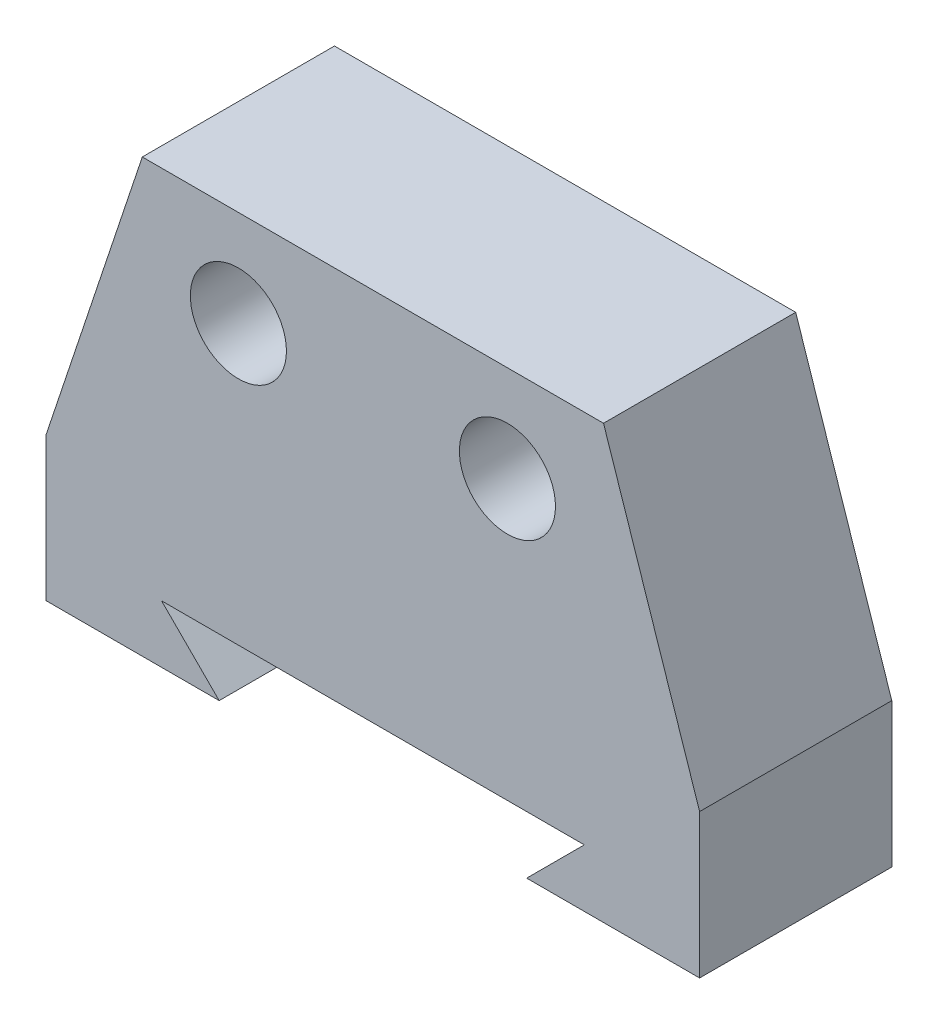
ISO-10303-21;
HEADER;
FILE_DESCRIPTION(('STEP AP214'),'2;1');
FILE_NAME('part.step','',(''),(''),'','','');
FILE_SCHEMA(('AUTOMOTIVE_DESIGN { 1 0 10303 214 1 1 1 1 }'));
ENDSEC;
DATA;
#1=APPLICATION_CONTEXT('core data for automotive mechanical design processes');
#2=APPLICATION_PROTOCOL_DEFINITION('international standard','automotive_design',2000,#1);
#3=PRODUCT_CONTEXT('',#1,'mechanical');
#4=PRODUCT('Part','Part','',(#3));
#5=PRODUCT_RELATED_PRODUCT_CATEGORY('part','',(#4));
#6=PRODUCT_DEFINITION_FORMATION('','',#4);
#7=PRODUCT_DEFINITION_CONTEXT('part definition',#1,'design');
#8=PRODUCT_DEFINITION('design','',#6,#7);
#9=PRODUCT_DEFINITION_SHAPE('','',#8);
#10=(LENGTH_UNIT() NAMED_UNIT(*) SI_UNIT(.MILLI.,.METRE.));
#11=(NAMED_UNIT(*) PLANE_ANGLE_UNIT() SI_UNIT($,.RADIAN.));
#12=(NAMED_UNIT(*) SI_UNIT($,.STERADIAN.) SOLID_ANGLE_UNIT());
#13=UNCERTAINTY_MEASURE_WITH_UNIT(LENGTH_MEASURE(1.E-05),#10,'distance_accuracy_value','');
#14=(GEOMETRIC_REPRESENTATION_CONTEXT(3) GLOBAL_UNCERTAINTY_ASSIGNED_CONTEXT((#13)) GLOBAL_UNIT_ASSIGNED_CONTEXT((#10,
#11,#12)) REPRESENTATION_CONTEXT('',''));
#15=CARTESIAN_POINT('',(0.,0.,0.));
#16=DIRECTION('',(0.,0.,1.));
#17=DIRECTION('',(1.,0.,0.));
#18=AXIS2_PLACEMENT_3D('',#15,#16,#17);
#19=CARTESIAN_POINT('',(0.,39.,10.));
#20=DIRECTION('',(0.,1.,0.));
#21=DIRECTION('',(-1.,0.,0.));
#22=AXIS2_PLACEMENT_3D('',#19,#20,#21);
#23=PLANE('',#22);
#24=DIRECTION('',(1.,0.,0.));
#25=VECTOR('',#24,1.);
#26=CARTESIAN_POINT('',(0.,39.,-10.));
#27=LINE('',#26,#25);
#28=CARTESIAN_POINT('',(-24.,39.,-10.));
#29=VERTEX_POINT('',#28);
#30=CARTESIAN_POINT('',(24.,39.,-10.));
#31=VERTEX_POINT('',#30);
#32=EDGE_CURVE('E146',#29,#31,#27,.T.);
#33=ORIENTED_EDGE('',*,*,#32,.F.);
#34=DIRECTION('',(0.,0.,-1.));
#35=VECTOR('',#34,1.);
#36=CARTESIAN_POINT('',(-24.,39.,10.));
#37=LINE('',#36,#35);
#38=CARTESIAN_POINT('',(-24.,39.,10.));
#39=VERTEX_POINT('',#38);
#40=EDGE_CURVE('E11',#39,#29,#37,.T.);
#41=ORIENTED_EDGE('',*,*,#40,.F.);
#42=DIRECTION('',(1.,0.,0.));
#43=VECTOR('',#42,1.);
#44=CARTESIAN_POINT('',(0.,39.,10.));
#45=LINE('',#44,#43);
#46=CARTESIAN_POINT('',(24.,39.,10.));
#47=VERTEX_POINT('',#46);
#48=EDGE_CURVE('E175',#39,#47,#45,.T.);
#49=ORIENTED_EDGE('',*,*,#48,.T.);
#50=DIRECTION('',(0.,0.,-1.));
#51=VECTOR('',#50,1.);
#52=CARTESIAN_POINT('',(24.,39.,10.));
#53=LINE('',#52,#51);
#54=EDGE_CURVE('E49',#47,#31,#53,.T.);
#55=ORIENTED_EDGE('',*,*,#54,.T.);
#56=EDGE_LOOP('',(#33,#41,#49,#55));
#57=FACE_BOUND('',#56,.T.);
#58=ADVANCED_FACE('F33',(#57),#23,.T.);
#59=CARTESIAN_POINT('',(-33.3,11.1,10.));
#60=DIRECTION('',(0.948683298050514,-0.316227766016838,0.));
#61=DIRECTION('',(0.316227766016838,0.948683298050514,0.));
#62=AXIS2_PLACEMENT_3D('',#59,#60,#61);
#63=PLANE('',#62);
#64=DIRECTION('',(-0.316227766016838,-0.948683298050514,0.));
#65=VECTOR('',#64,1.);
#66=CARTESIAN_POINT('',(-33.3,11.1,-10.));
#67=LINE('',#66,#65);
#68=CARTESIAN_POINT('',(-34.,9.,-10.));
#69=VERTEX_POINT('',#68);
#70=EDGE_CURVE('E148',#29,#69,#67,.T.);
#71=ORIENTED_EDGE('',*,*,#70,.T.);
#72=DIRECTION('',(0.,0.,-1.));
#73=VECTOR('',#72,1.);
#74=CARTESIAN_POINT('',(-34.,9.,10.));
#75=LINE('',#74,#73);
#76=CARTESIAN_POINT('',(-34.,9.,10.));
#77=VERTEX_POINT('',#76);
#78=EDGE_CURVE('E41',#77,#69,#75,.T.);
#79=ORIENTED_EDGE('',*,*,#78,.F.);
#80=DIRECTION('',(-0.316227766016838,-0.948683298050514,0.));
#81=VECTOR('',#80,1.);
#82=CARTESIAN_POINT('',(-33.3,11.1,10.));
#83=LINE('',#82,#81);
#84=EDGE_CURVE('E214',#39,#77,#83,.T.);
#85=ORIENTED_EDGE('',*,*,#84,.F.);
#86=ORIENTED_EDGE('',*,*,#40,.T.);
#87=EDGE_LOOP('',(#71,#79,#85,#86));
#88=FACE_BOUND('',#87,.T.);
#89=ADVANCED_FACE('F240',(#88),#63,.F.);
#90=CARTESIAN_POINT('',(-34.,0.,10.));
#91=DIRECTION('',(1.,0.,0.));
#92=DIRECTION('',(0.,1.,0.));
#93=AXIS2_PLACEMENT_3D('',#90,#91,#92);
#94=PLANE('',#93);
#95=DIRECTION('',(0.,-1.,0.));
#96=VECTOR('',#95,1.);
#97=CARTESIAN_POINT('',(-34.,0.,-10.));
#98=LINE('',#97,#96);
#99=CARTESIAN_POINT('',(-34.,-6.,-10.));
#100=VERTEX_POINT('',#99);
#101=EDGE_CURVE('E150',#69,#100,#98,.T.);
#102=ORIENTED_EDGE('',*,*,#101,.T.);
#103=DIRECTION('',(0.,0.,-1.));
#104=VECTOR('',#103,1.);
#105=CARTESIAN_POINT('',(-34.,-6.,10.));
#106=LINE('',#105,#104);
#107=CARTESIAN_POINT('',(-34.,-6.,10.));
#108=VERTEX_POINT('',#107);
#109=EDGE_CURVE('E186',#108,#100,#106,.T.);
#110=ORIENTED_EDGE('',*,*,#109,.F.);
#111=DIRECTION('',(0.,-1.,0.));
#112=VECTOR('',#111,1.);
#113=CARTESIAN_POINT('',(-34.,0.,10.));
#114=LINE('',#113,#112);
#115=EDGE_CURVE('E194',#77,#108,#114,.T.);
#116=ORIENTED_EDGE('',*,*,#115,.F.);
#117=ORIENTED_EDGE('',*,*,#78,.T.);
#118=EDGE_LOOP('',(#102,#110,#116,#117));
#119=FACE_BOUND('',#118,.T.);
#120=ADVANCED_FACE('F192',(#119),#94,.F.);
#121=CARTESIAN_POINT('',(0.,-6.,10.));
#122=DIRECTION('',(0.,-1.,0.));
#123=DIRECTION('',(1.,0.,0.));
#124=AXIS2_PLACEMENT_3D('',#121,#122,#123);
#125=PLANE('',#124);
#126=DIRECTION('',(-1.,0.,0.));
#127=VECTOR('',#126,1.);
#128=CARTESIAN_POINT('',(0.,-6.,-10.));
#129=LINE('',#128,#127);
#130=CARTESIAN_POINT('',(-16.,-6.,-10.));
#131=VERTEX_POINT('',#130);
#132=EDGE_CURVE('E153',#131,#100,#129,.T.);
#133=ORIENTED_EDGE('',*,*,#132,.F.);
#134=DIRECTION('',(0.,0.,-1.));
#135=VECTOR('',#134,1.);
#136=CARTESIAN_POINT('',(-16.,-6.,10.));
#137=LINE('',#136,#135);
#138=CARTESIAN_POINT('',(-16.,-6.,10.));
#139=VERTEX_POINT('',#138);
#140=EDGE_CURVE('E184',#139,#131,#137,.T.);
#141=ORIENTED_EDGE('',*,*,#140,.F.);
#142=DIRECTION('',(-1.,0.,0.));
#143=VECTOR('',#142,1.);
#144=CARTESIAN_POINT('',(0.,-6.,10.));
#145=LINE('',#144,#143);
#146=EDGE_CURVE('E207',#139,#108,#145,.T.);
#147=ORIENTED_EDGE('',*,*,#146,.T.);
#148=ORIENTED_EDGE('',*,*,#109,.T.);
#149=EDGE_LOOP('',(#133,#141,#147,#148));
#150=FACE_BOUND('',#149,.T.);
#151=ADVANCED_FACE('F204',(#150),#125,.T.);
#152=CARTESIAN_POINT('',(-11.,-11.,10.));
#153=DIRECTION('',(0.707106781186549,0.707106781186546,0.));
#154=DIRECTION('',(-0.707106781186546,0.707106781186549,0.));
#155=AXIS2_PLACEMENT_3D('',#152,#153,#154);
#156=PLANE('',#155);
#157=DIRECTION('',(0.707106781186546,-0.707106781186549,0.));
#158=VECTOR('',#157,1.);
#159=CARTESIAN_POINT('',(-11.,-11.,-10.));
#160=LINE('',#159,#158);
#161=CARTESIAN_POINT('',(-22.,0.,-10.));
#162=VERTEX_POINT('',#161);
#163=EDGE_CURVE('E156',#162,#131,#160,.T.);
#164=ORIENTED_EDGE('',*,*,#163,.F.);
#165=DIRECTION('',(0.,0.,-1.));
#166=VECTOR('',#165,1.);
#167=CARTESIAN_POINT('',(-22.,0.,10.));
#168=LINE('',#167,#166);
#169=CARTESIAN_POINT('',(-22.,0.,10.));
#170=VERTEX_POINT('',#169);
#171=EDGE_CURVE('E182',#170,#162,#168,.T.);
#172=ORIENTED_EDGE('',*,*,#171,.F.);
#173=DIRECTION('',(0.707106781186546,-0.707106781186549,0.));
#174=VECTOR('',#173,1.);
#175=CARTESIAN_POINT('',(-11.,-11.,10.));
#176=LINE('',#175,#174);
#177=EDGE_CURVE('E210',#170,#139,#176,.T.);
#178=ORIENTED_EDGE('',*,*,#177,.T.);
#179=ORIENTED_EDGE('',*,*,#140,.T.);
#180=EDGE_LOOP('',(#164,#172,#178,#179));
#181=FACE_BOUND('',#180,.T.);
#182=ADVANCED_FACE('F251',(#181),#156,.T.);
#183=CARTESIAN_POINT('',(0.,0.,10.));
#184=DIRECTION('',(0.,1.,0.));
#185=DIRECTION('',(-1.,0.,0.));
#186=AXIS2_PLACEMENT_3D('',#183,#184,#185);
#187=PLANE('',#186);
#188=DIRECTION('',(1.,0.,0.));
#189=VECTOR('',#188,1.);
#190=CARTESIAN_POINT('',(0.,0.,-10.));
#191=LINE('',#190,#189);
#192=CARTESIAN_POINT('',(22.,0.,-10.));
#193=VERTEX_POINT('',#192);
#194=EDGE_CURVE('E159',#162,#193,#191,.T.);
#195=ORIENTED_EDGE('',*,*,#194,.T.);
#196=DIRECTION('',(0.,0.,-1.));
#197=VECTOR('',#196,1.);
#198=CARTESIAN_POINT('',(22.,0.,10.));
#199=LINE('',#198,#197);
#200=CARTESIAN_POINT('',(22.,0.,10.));
#201=VERTEX_POINT('',#200);
#202=EDGE_CURVE('E179',#201,#193,#199,.T.);
#203=ORIENTED_EDGE('',*,*,#202,.F.);
#204=DIRECTION('',(1.,0.,0.));
#205=VECTOR('',#204,1.);
#206=CARTESIAN_POINT('',(0.,0.,10.));
#207=LINE('',#206,#205);
#208=EDGE_CURVE('E212',#170,#201,#207,.T.);
#209=ORIENTED_EDGE('',*,*,#208,.F.);
#210=ORIENTED_EDGE('',*,*,#171,.T.);
#211=EDGE_LOOP('',(#195,#203,#209,#210));
#212=FACE_BOUND('',#211,.T.);
#213=ADVANCED_FACE('F221',(#212),#187,.F.);
#214=CARTESIAN_POINT('',(11.,-11.,10.));
#215=DIRECTION('',(0.707106781186549,-0.707106781186546,0.));
#216=DIRECTION('',(0.707106781186546,0.707106781186549,0.));
#217=AXIS2_PLACEMENT_3D('',#214,#215,#216);
#218=PLANE('',#217);
#219=DIRECTION('',(-0.707106781186546,-0.707106781186549,0.));
#220=VECTOR('',#219,1.);
#221=CARTESIAN_POINT('',(11.,-11.,-10.));
#222=LINE('',#221,#220);
#223=CARTESIAN_POINT('',(16.,-5.99999999999999,-10.));
#224=VERTEX_POINT('',#223);
#225=EDGE_CURVE('E161',#193,#224,#222,.T.);
#226=ORIENTED_EDGE('',*,*,#225,.T.);
#227=DIRECTION('',(0.,0.,-1.));
#228=VECTOR('',#227,1.);
#229=CARTESIAN_POINT('',(16.,-5.99999999999999,10.));
#230=LINE('',#229,#228);
#231=CARTESIAN_POINT('',(16.,-5.99999999999999,10.));
#232=VERTEX_POINT('',#231);
#233=EDGE_CURVE('E132',#232,#224,#230,.T.);
#234=ORIENTED_EDGE('',*,*,#233,.F.);
#235=DIRECTION('',(-0.707106781186546,-0.707106781186549,0.));
#236=VECTOR('',#235,1.);
#237=CARTESIAN_POINT('',(11.,-11.,10.));
#238=LINE('',#237,#236);
#239=EDGE_CURVE('E120',#201,#232,#238,.T.);
#240=ORIENTED_EDGE('',*,*,#239,.F.);
#241=ORIENTED_EDGE('',*,*,#202,.T.);
#242=EDGE_LOOP('',(#226,#234,#240,#241));
#243=FACE_BOUND('',#242,.T.);
#244=ADVANCED_FACE('F224',(#243),#218,.F.);
#245=CARTESIAN_POINT('',(0.,-6.,10.));
#246=DIRECTION('',(0.,1.,0.));
#247=DIRECTION('',(-1.,0.,0.));
#248=AXIS2_PLACEMENT_3D('',#245,#246,#247);
#249=PLANE('',#248);
#250=DIRECTION('',(1.,0.,0.));
#251=VECTOR('',#250,1.);
#252=CARTESIAN_POINT('',(0.,-6.,-10.));
#253=LINE('',#252,#251);
#254=CARTESIAN_POINT('',(34.,-5.99999999999999,-10.));
#255=VERTEX_POINT('',#254);
#256=EDGE_CURVE('E129',#224,#255,#253,.T.);
#257=ORIENTED_EDGE('',*,*,#256,.T.);
#258=DIRECTION('',(0.,0.,-1.));
#259=VECTOR('',#258,1.);
#260=CARTESIAN_POINT('',(34.,-5.99999999999999,10.));
#261=LINE('',#260,#259);
#262=CARTESIAN_POINT('',(34.,-5.99999999999999,10.));
#263=VERTEX_POINT('',#262);
#264=EDGE_CURVE('E126',#263,#255,#261,.T.);
#265=ORIENTED_EDGE('',*,*,#264,.F.);
#266=DIRECTION('',(1.,0.,0.));
#267=VECTOR('',#266,1.);
#268=CARTESIAN_POINT('',(0.,-6.,10.));
#269=LINE('',#268,#267);
#270=EDGE_CURVE('E111',#232,#263,#269,.T.);
#271=ORIENTED_EDGE('',*,*,#270,.F.);
#272=ORIENTED_EDGE('',*,*,#233,.T.);
#273=EDGE_LOOP('',(#257,#265,#271,#272));
#274=FACE_BOUND('',#273,.T.);
#275=ADVANCED_FACE('F127',(#274),#249,.F.);
#276=CARTESIAN_POINT('',(34.,0.,10.));
#277=DIRECTION('',(-1.,0.,0.));
#278=DIRECTION('',(0.,0.,1.));
#279=AXIS2_PLACEMENT_3D('',#276,#277,#278);
#280=PLANE('',#279);
#281=DIRECTION('',(0.,1.,0.));
#282=VECTOR('',#281,1.);
#283=CARTESIAN_POINT('',(34.,0.,-10.));
#284=LINE('',#283,#282);
#285=CARTESIAN_POINT('',(34.,9.00000000000001,-10.));
#286=VERTEX_POINT('',#285);
#287=EDGE_CURVE('E164',#255,#286,#284,.T.);
#288=ORIENTED_EDGE('',*,*,#287,.T.);
#289=DIRECTION('',(0.,0.,-1.));
#290=VECTOR('',#289,1.);
#291=CARTESIAN_POINT('',(34.,9.00000000000001,10.));
#292=LINE('',#291,#290);
#293=CARTESIAN_POINT('',(34.,9.00000000000001,10.));
#294=VERTEX_POINT('',#293);
#295=EDGE_CURVE('E81',#294,#286,#292,.T.);
#296=ORIENTED_EDGE('',*,*,#295,.F.);
#297=DIRECTION('',(0.,1.,0.));
#298=VECTOR('',#297,1.);
#299=CARTESIAN_POINT('',(34.,0.,10.));
#300=LINE('',#299,#298);
#301=EDGE_CURVE('E118',#263,#294,#300,.T.);
#302=ORIENTED_EDGE('',*,*,#301,.F.);
#303=ORIENTED_EDGE('',*,*,#264,.T.);
#304=EDGE_LOOP('',(#288,#296,#302,#303));
#305=FACE_BOUND('',#304,.T.);
#306=ADVANCED_FACE('F134',(#305),#280,.F.);
#307=CARTESIAN_POINT('',(-14.,29.,10.));
#308=DIRECTION('',(0.,0.,-1.));
#309=DIRECTION('',(-1.,0.,0.));
#310=AXIS2_PLACEMENT_3D('',#307,#308,#309);
#311=CYLINDRICAL_SURFACE('',#310,5.);
#312=CARTESIAN_POINT('',(-14.,29.,10.));
#313=DIRECTION('',(0.,0.,1.));
#314=DIRECTION('',(1.,0.,0.));
#315=AXIS2_PLACEMENT_3D('',#312,#313,#314);
#316=CIRCLE('',#315,5.);
#317=CARTESIAN_POINT('',(-9.00000000000001,29.,10.));
#318=VERTEX_POINT('',#317);
#319=EDGE_CURVE('E137',#318,#318,#316,.T.);
#320=ORIENTED_EDGE('',*,*,#319,.T.);
#321=EDGE_LOOP('',(#320));
#322=FACE_BOUND('',#321,.T.);
#323=CARTESIAN_POINT('',(-14.,29.,-10.));
#324=DIRECTION('',(0.,0.,1.));
#325=DIRECTION('',(1.,0.,0.));
#326=AXIS2_PLACEMENT_3D('',#323,#324,#325);
#327=CIRCLE('',#326,5.);
#328=CARTESIAN_POINT('',(-9.00000000000001,29.,-10.));
#329=VERTEX_POINT('',#328);
#330=EDGE_CURVE('E169',#329,#329,#327,.T.);
#331=ORIENTED_EDGE('',*,*,#330,.F.);
#332=EDGE_LOOP('',(#331));
#333=FACE_BOUND('',#332,.T.);
#334=ADVANCED_FACE('F228',(#322,#333),#311,.F.);
#335=CARTESIAN_POINT('',(33.3,11.1,10.));
#336=DIRECTION('',(0.948683298050514,0.316227766016838,0.));
#337=DIRECTION('',(-0.316227766016838,0.948683298050514,0.));
#338=AXIS2_PLACEMENT_3D('',#335,#336,#337);
#339=PLANE('',#338);
#340=DIRECTION('',(0.316227766016838,-0.948683298050514,0.));
#341=VECTOR('',#340,1.);
#342=CARTESIAN_POINT('',(33.3,11.1,-10.));
#343=LINE('',#342,#341);
#344=EDGE_CURVE('E166',#31,#286,#343,.T.);
#345=ORIENTED_EDGE('',*,*,#344,.F.);
#346=ORIENTED_EDGE('',*,*,#54,.F.);
#347=DIRECTION('',(0.316227766016838,-0.948683298050514,0.));
#348=VECTOR('',#347,1.);
#349=CARTESIAN_POINT('',(33.3,11.1,10.));
#350=LINE('',#349,#348);
#351=EDGE_CURVE('E135',#47,#294,#350,.T.);
#352=ORIENTED_EDGE('',*,*,#351,.T.);
#353=ORIENTED_EDGE('',*,*,#295,.T.);
#354=EDGE_LOOP('',(#345,#346,#352,#353));
#355=FACE_BOUND('',#354,.T.);
#356=ADVANCED_FACE('F225',(#355),#339,.T.);
#357=CARTESIAN_POINT('',(14.,29.,10.));
#358=DIRECTION('',(0.,0.,-1.));
#359=DIRECTION('',(-1.,0.,0.));
#360=AXIS2_PLACEMENT_3D('',#357,#358,#359);
#361=CYLINDRICAL_SURFACE('',#360,5.);
#362=CARTESIAN_POINT('',(14.,29.,10.));
#363=DIRECTION('',(0.,0.,1.));
#364=DIRECTION('',(1.,0.,0.));
#365=AXIS2_PLACEMENT_3D('',#362,#363,#364);
#366=CIRCLE('',#365,5.);
#367=CARTESIAN_POINT('',(19.,29.,10.));
#368=VERTEX_POINT('',#367);
#369=EDGE_CURVE('E143',#368,#368,#366,.F.);
#370=ORIENTED_EDGE('',*,*,#369,.F.);
#371=EDGE_LOOP('',(#370));
#372=FACE_BOUND('',#371,.T.);
#373=CARTESIAN_POINT('',(14.,29.,-10.));
#374=DIRECTION('',(0.,0.,1.));
#375=DIRECTION('',(1.,0.,0.));
#376=AXIS2_PLACEMENT_3D('',#373,#374,#375);
#377=CIRCLE('',#376,5.);
#378=CARTESIAN_POINT('',(19.,29.,-10.));
#379=VERTEX_POINT('',#378);
#380=EDGE_CURVE('E172',#379,#379,#377,.F.);
#381=ORIENTED_EDGE('',*,*,#380,.T.);
#382=EDGE_LOOP('',(#381));
#383=FACE_BOUND('',#382,.T.);
#384=ADVANCED_FACE('F227',(#372,#383),#361,.F.);
#385=CARTESIAN_POINT('',(0.,0.,10.));
#386=DIRECTION('',(0.,0.,1.));
#387=DIRECTION('',(1.,0.,0.));
#388=AXIS2_PLACEMENT_3D('',#385,#386,#387);
#389=PLANE('',#388);
#390=ORIENTED_EDGE('',*,*,#48,.F.);
#391=ORIENTED_EDGE('',*,*,#84,.T.);
#392=ORIENTED_EDGE('',*,*,#115,.T.);
#393=ORIENTED_EDGE('',*,*,#146,.F.);
#394=ORIENTED_EDGE('',*,*,#177,.F.);
#395=ORIENTED_EDGE('',*,*,#208,.T.);
#396=ORIENTED_EDGE('',*,*,#239,.T.);
#397=ORIENTED_EDGE('',*,*,#270,.T.);
#398=ORIENTED_EDGE('',*,*,#301,.T.);
#399=ORIENTED_EDGE('',*,*,#351,.F.);
#400=EDGE_LOOP('',(#390,#391,#392,#393,#394,#395,#396,#397,#398,#399));
#401=FACE_BOUND('',#400,.T.);
#402=ORIENTED_EDGE('',*,*,#319,.F.);
#403=EDGE_LOOP('',(#402));
#404=FACE_BOUND('',#403,.T.);
#405=ORIENTED_EDGE('',*,*,#369,.T.);
#406=EDGE_LOOP('',(#405));
#407=FACE_BOUND('',#406,.T.);
#408=ADVANCED_FACE('F114',(#401,#404,#407),#389,.T.);
#409=CARTESIAN_POINT('',(0.,0.,-10.));
#410=DIRECTION('',(0.,0.,1.));
#411=DIRECTION('',(1.,0.,0.));
#412=AXIS2_PLACEMENT_3D('',#409,#410,#411);
#413=PLANE('',#412);
#414=ORIENTED_EDGE('',*,*,#32,.T.);
#415=ORIENTED_EDGE('',*,*,#344,.T.);
#416=ORIENTED_EDGE('',*,*,#287,.F.);
#417=ORIENTED_EDGE('',*,*,#256,.F.);
#418=ORIENTED_EDGE('',*,*,#225,.F.);
#419=ORIENTED_EDGE('',*,*,#194,.F.);
#420=ORIENTED_EDGE('',*,*,#163,.T.);
#421=ORIENTED_EDGE('',*,*,#132,.T.);
#422=ORIENTED_EDGE('',*,*,#101,.F.);
#423=ORIENTED_EDGE('',*,*,#70,.F.);
#424=EDGE_LOOP('',(#414,#415,#416,#417,#418,#419,#420,#421,#422,#423));
#425=FACE_BOUND('',#424,.T.);
#426=ORIENTED_EDGE('',*,*,#330,.T.);
#427=EDGE_LOOP('',(#426));
#428=FACE_BOUND('',#427,.T.);
#429=ORIENTED_EDGE('',*,*,#380,.F.);
#430=EDGE_LOOP('',(#429));
#431=FACE_BOUND('',#430,.T.);
#432=ADVANCED_FACE('F198',(#425,#428,#431),#413,.F.);
#433=CLOSED_SHELL('',(#58,#89,#120,#151,#182,#213,#244,#275,#306,#334,#356,#384,#408,#432));
#434=MANIFOLD_SOLID_BREP('B2',#433);
#435=ADVANCED_BREP_SHAPE_REPRESENTATION('',(#18,#434),#14);
#436=SHAPE_DEFINITION_REPRESENTATION(#9,#435);
ENDSEC;
END-ISO-10303-21;
